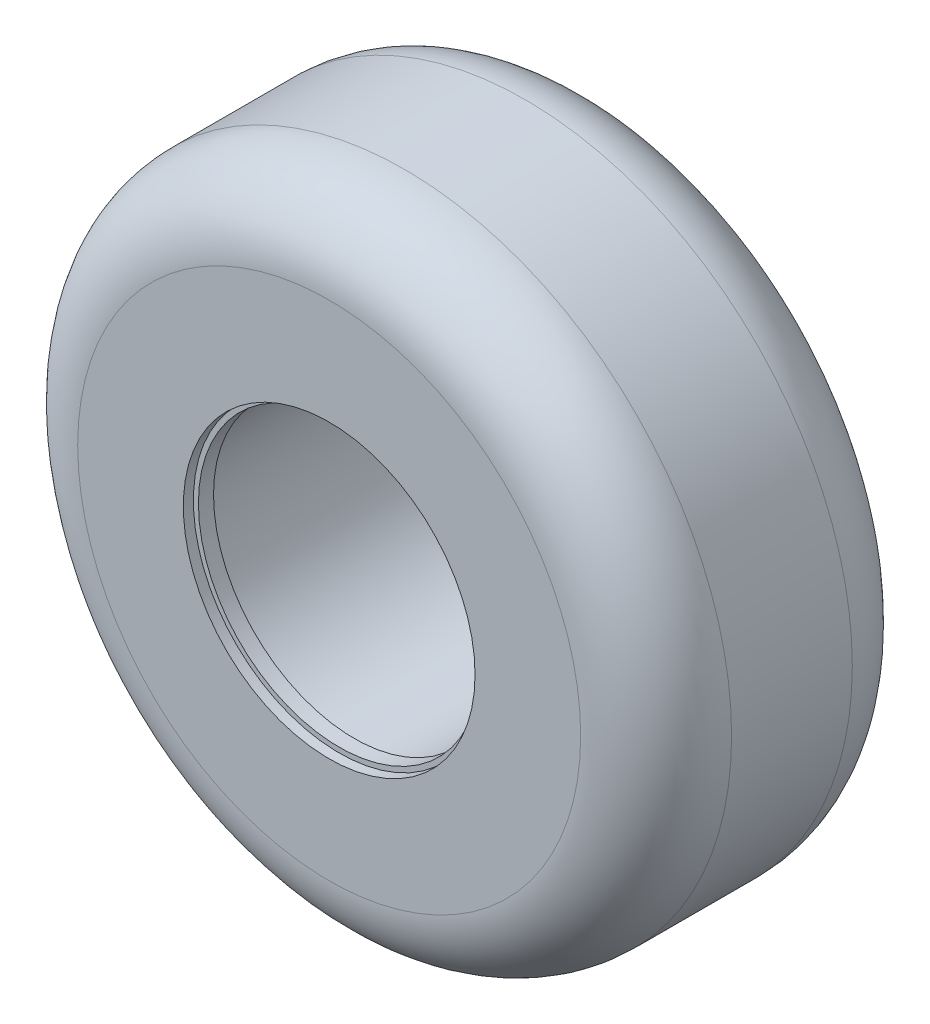
ISO-10303-21;
HEADER;
FILE_DESCRIPTION(('STEP AP214'),'2;1');
FILE_NAME('part.step','',(''),(''),'','','');
FILE_SCHEMA(('AUTOMOTIVE_DESIGN { 1 0 10303 214 1 1 1 1 }'));
ENDSEC;
DATA;
#1=APPLICATION_CONTEXT('core data for automotive mechanical design processes');
#2=APPLICATION_PROTOCOL_DEFINITION('international standard','automotive_design',2000,#1);
#3=PRODUCT_CONTEXT('',#1,'mechanical');
#4=PRODUCT('Part','Part','',(#3));
#5=PRODUCT_RELATED_PRODUCT_CATEGORY('part','',(#4));
#6=PRODUCT_DEFINITION_FORMATION('','',#4);
#7=PRODUCT_DEFINITION_CONTEXT('part definition',#1,'design');
#8=PRODUCT_DEFINITION('design','',#6,#7);
#9=PRODUCT_DEFINITION_SHAPE('','',#8);
#10=(LENGTH_UNIT() NAMED_UNIT(*) SI_UNIT(.MILLI.,.METRE.));
#11=(NAMED_UNIT(*) PLANE_ANGLE_UNIT() SI_UNIT($,.RADIAN.));
#12=(NAMED_UNIT(*) SI_UNIT($,.STERADIAN.) SOLID_ANGLE_UNIT());
#13=UNCERTAINTY_MEASURE_WITH_UNIT(LENGTH_MEASURE(1.E-05),#10,'distance_accuracy_value','');
#14=(GEOMETRIC_REPRESENTATION_CONTEXT(3) GLOBAL_UNCERTAINTY_ASSIGNED_CONTEXT((#13)) GLOBAL_UNIT_ASSIGNED_CONTEXT((#10,
#11,#12)) REPRESENTATION_CONTEXT('',''));
#15=CARTESIAN_POINT('',(0.,0.,0.));
#16=DIRECTION('',(0.,0.,1.));
#17=DIRECTION('',(1.,0.,0.));
#18=AXIS2_PLACEMENT_3D('',#15,#16,#17);
#19=CARTESIAN_POINT('',(0.,0.,54.));
#20=DIRECTION('',(0.,0.,-1.));
#21=DIRECTION('',(-1.,0.,0.));
#22=AXIS2_PLACEMENT_3D('',#19,#20,#21);
#23=CYLINDRICAL_SURFACE('',#22,28.);
#24=CARTESIAN_POINT('',(0.,0.,2.));
#25=DIRECTION('',(0.,0.,-1.));
#26=DIRECTION('',(-1.,0.,0.));
#27=AXIS2_PLACEMENT_3D('',#24,#25,#26);
#28=CIRCLE('',#27,28.);
#29=CARTESIAN_POINT('',(-28.,0.,2.));
#30=VERTEX_POINT('',#29);
#31=EDGE_CURVE('E52',#30,#30,#28,.T.);
#32=ORIENTED_EDGE('',*,*,#31,.T.);
#33=EDGE_LOOP('',(#32));
#34=FACE_BOUND('',#33,.T.);
#35=CARTESIAN_POINT('',(0.,0.,5.));
#36=DIRECTION('',(0.,0.,1.));
#37=DIRECTION('',(1.,0.,0.));
#38=AXIS2_PLACEMENT_3D('',#35,#36,#37);
#39=CIRCLE('',#38,28.);
#40=CARTESIAN_POINT('',(28.,0.,5.));
#41=VERTEX_POINT('',#40);
#42=EDGE_CURVE('E53',#41,#41,#39,.T.);
#43=ORIENTED_EDGE('',*,*,#42,.T.);
#44=EDGE_LOOP('',(#43));
#45=FACE_BOUND('',#44,.T.);
#46=ADVANCED_FACE('F32',(#34,#45),#23,.F.);
#47=CARTESIAN_POINT('',(0.,0.,49.));
#48=DIRECTION('',(0.,0.,1.));
#49=DIRECTION('',(1.,0.,0.));
#50=AXIS2_PLACEMENT_3D('',#47,#48,#49);
#51=CIRCLE('',#50,28.);
#52=CARTESIAN_POINT('',(28.,0.,49.));
#53=VERTEX_POINT('',#52);
#54=EDGE_CURVE('E57',#53,#53,#51,.T.);
#55=ORIENTED_EDGE('',*,*,#54,.F.);
#56=EDGE_LOOP('',(#55));
#57=FACE_BOUND('',#56,.T.);
#58=CARTESIAN_POINT('',(0.,0.,52.));
#59=DIRECTION('',(0.,0.,1.));
#60=DIRECTION('',(1.,0.,0.));
#61=AXIS2_PLACEMENT_3D('',#58,#59,#60);
#62=CIRCLE('',#61,28.);
#63=CARTESIAN_POINT('',(28.,0.,52.));
#64=VERTEX_POINT('',#63);
#65=EDGE_CURVE('E61',#64,#64,#62,.T.);
#66=ORIENTED_EDGE('',*,*,#65,.T.);
#67=EDGE_LOOP('',(#66));
#68=FACE_BOUND('',#67,.T.);
#69=ADVANCED_FACE('F104',(#57,#68),#23,.F.);
#70=CARTESIAN_POINT('',(0.,0.,54.));
#71=DIRECTION('',(0.,0.,1.));
#72=DIRECTION('',(1.,0.,0.));
#73=AXIS2_PLACEMENT_3D('',#70,#71,#72);
#74=PLANE('',#73);
#75=CARTESIAN_POINT('',(0.,0.,54.));
#76=DIRECTION('',(0.,0.,1.));
#77=DIRECTION('',(1.,0.,0.));
#78=AXIS2_PLACEMENT_3D('',#75,#76,#77);
#79=CIRCLE('',#78,50.);
#80=CARTESIAN_POINT('',(50.,0.,54.));
#81=VERTEX_POINT('',#80);
#82=EDGE_CURVE('E10',#81,#81,#79,.T.);
#83=ORIENTED_EDGE('',*,*,#82,.T.);
#84=EDGE_LOOP('',(#83));
#85=FACE_BOUND('',#84,.T.);
#86=CARTESIAN_POINT('',(0.,0.,54.));
#87=DIRECTION('',(0.,0.,1.));
#88=DIRECTION('',(1.,0.,0.));
#89=AXIS2_PLACEMENT_3D('',#86,#87,#88);
#90=CIRCLE('',#89,29.);
#91=CARTESIAN_POINT('',(29.,0.,54.));
#92=VERTEX_POINT('',#91);
#93=EDGE_CURVE('E56',#92,#92,#90,.T.);
#94=ORIENTED_EDGE('',*,*,#93,.F.);
#95=EDGE_LOOP('',(#94));
#96=FACE_BOUND('',#95,.T.);
#97=ADVANCED_FACE('F110',(#85,#96),#74,.T.);
#98=CARTESIAN_POINT('',(0.,0.,0.));
#99=DIRECTION('',(0.,0.,1.));
#100=DIRECTION('',(1.,0.,0.));
#101=AXIS2_PLACEMENT_3D('',#98,#99,#100);
#102=PLANE('',#101);
#103=CARTESIAN_POINT('',(0.,0.,0.));
#104=DIRECTION('',(0.,0.,1.));
#105=DIRECTION('',(1.,0.,0.));
#106=AXIS2_PLACEMENT_3D('',#103,#104,#105);
#107=CIRCLE('',#106,50.);
#108=CARTESIAN_POINT('',(50.,0.,0.));
#109=VERTEX_POINT('',#108);
#110=EDGE_CURVE('E39',#109,#109,#107,.F.);
#111=ORIENTED_EDGE('',*,*,#110,.T.);
#112=EDGE_LOOP('',(#111));
#113=FACE_BOUND('',#112,.T.);
#114=CARTESIAN_POINT('',(0.,0.,0.));
#115=DIRECTION('',(0.,0.,-1.));
#116=DIRECTION('',(-1.,0.,0.));
#117=AXIS2_PLACEMENT_3D('',#114,#115,#116);
#118=CIRCLE('',#117,29.);
#119=CARTESIAN_POINT('',(-29.,0.,0.));
#120=VERTEX_POINT('',#119);
#121=EDGE_CURVE('E64',#120,#120,#118,.T.);
#122=ORIENTED_EDGE('',*,*,#121,.F.);
#123=EDGE_LOOP('',(#122));
#124=FACE_BOUND('',#123,.T.);
#125=ADVANCED_FACE('F119',(#113,#124),#102,.F.);
#126=CARTESIAN_POINT('',(0.,0.,54.));
#127=DIRECTION('',(0.,0.,-1.));
#128=DIRECTION('',(-1.,0.,0.));
#129=AXIS2_PLACEMENT_3D('',#126,#127,#128);
#130=CYLINDRICAL_SURFACE('',#129,65.);
#131=CARTESIAN_POINT('',(0.,0.,15.));
#132=DIRECTION('',(0.,0.,1.));
#133=DIRECTION('',(1.,0.,0.));
#134=AXIS2_PLACEMENT_3D('',#131,#132,#133);
#135=CIRCLE('',#134,65.);
#136=CARTESIAN_POINT('',(65.,0.,15.));
#137=VERTEX_POINT('',#136);
#138=EDGE_CURVE('E43',#137,#137,#135,.T.);
#139=ORIENTED_EDGE('',*,*,#138,.T.);
#140=EDGE_LOOP('',(#139));
#141=FACE_BOUND('',#140,.T.);
#142=CARTESIAN_POINT('',(0.,0.,39.));
#143=DIRECTION('',(0.,0.,1.));
#144=DIRECTION('',(1.,0.,0.));
#145=AXIS2_PLACEMENT_3D('',#142,#143,#144);
#146=CIRCLE('',#145,65.);
#147=CARTESIAN_POINT('',(65.,0.,39.));
#148=VERTEX_POINT('',#147);
#149=EDGE_CURVE('E47',#148,#148,#146,.F.);
#150=ORIENTED_EDGE('',*,*,#149,.T.);
#151=EDGE_LOOP('',(#150));
#152=FACE_BOUND('',#151,.T.);
#153=ADVANCED_FACE('F122',(#141,#152),#130,.T.);
#154=CARTESIAN_POINT('',(0.,0.,2.));
#155=DIRECTION('',(0.,0.,-1.));
#156=DIRECTION('',(-1.,0.,0.));
#157=AXIS2_PLACEMENT_3D('',#154,#155,#156);
#158=CYLINDRICAL_SURFACE('',#157,29.);
#159=CARTESIAN_POINT('',(0.,0.,2.));
#160=DIRECTION('',(0.,0.,-1.));
#161=DIRECTION('',(-1.,0.,0.));
#162=AXIS2_PLACEMENT_3D('',#159,#160,#161);
#163=CIRCLE('',#162,29.);
#164=CARTESIAN_POINT('',(-29.,0.,2.));
#165=VERTEX_POINT('',#164);
#166=EDGE_CURVE('E68',#165,#165,#163,.T.);
#167=ORIENTED_EDGE('',*,*,#166,.F.);
#168=EDGE_LOOP('',(#167));
#169=FACE_BOUND('',#168,.T.);
#170=ORIENTED_EDGE('',*,*,#121,.T.);
#171=EDGE_LOOP('',(#170));
#172=FACE_BOUND('',#171,.T.);
#173=ADVANCED_FACE('F115',(#169,#172),#158,.F.);
#174=CARTESIAN_POINT('',(0.,0.,2.));
#175=DIRECTION('',(0.,0.,-1.));
#176=DIRECTION('',(-1.,0.,0.));
#177=AXIS2_PLACEMENT_3D('',#174,#175,#176);
#178=PLANE('',#177);
#179=ORIENTED_EDGE('',*,*,#31,.F.);
#180=EDGE_LOOP('',(#179));
#181=FACE_BOUND('',#180,.T.);
#182=ORIENTED_EDGE('',*,*,#166,.T.);
#183=EDGE_LOOP('',(#182));
#184=FACE_BOUND('',#183,.T.);
#185=ADVANCED_FACE('F150',(#181,#184),#178,.T.);
#186=CARTESIAN_POINT('',(0.,0.,52.));
#187=DIRECTION('',(0.,0.,1.));
#188=DIRECTION('',(1.,0.,0.));
#189=AXIS2_PLACEMENT_3D('',#186,#187,#188);
#190=CYLINDRICAL_SURFACE('',#189,29.);
#191=CARTESIAN_POINT('',(0.,0.,52.));
#192=DIRECTION('',(0.,0.,1.));
#193=DIRECTION('',(1.,0.,0.));
#194=AXIS2_PLACEMENT_3D('',#191,#192,#193);
#195=CIRCLE('',#194,29.);
#196=CARTESIAN_POINT('',(29.,0.,52.));
#197=VERTEX_POINT('',#196);
#198=EDGE_CURVE('E65',#197,#197,#195,.T.);
#199=ORIENTED_EDGE('',*,*,#198,.F.);
#200=EDGE_LOOP('',(#199));
#201=FACE_BOUND('',#200,.T.);
#202=ORIENTED_EDGE('',*,*,#93,.T.);
#203=EDGE_LOOP('',(#202));
#204=FACE_BOUND('',#203,.T.);
#205=ADVANCED_FACE('F99',(#201,#204),#190,.F.);
#206=CARTESIAN_POINT('',(0.,0.,52.));
#207=DIRECTION('',(0.,0.,1.));
#208=DIRECTION('',(1.,0.,0.));
#209=AXIS2_PLACEMENT_3D('',#206,#207,#208);
#210=PLANE('',#209);
#211=ORIENTED_EDGE('',*,*,#65,.F.);
#212=EDGE_LOOP('',(#211));
#213=FACE_BOUND('',#212,.T.);
#214=ORIENTED_EDGE('',*,*,#198,.T.);
#215=EDGE_LOOP('',(#214));
#216=FACE_BOUND('',#215,.T.);
#217=ADVANCED_FACE('F93',(#213,#216),#210,.T.);
#218=CARTESIAN_POINT('',(0.,0.,5.));
#219=DIRECTION('',(0.,0.,1.));
#220=DIRECTION('',(1.,0.,0.));
#221=AXIS2_PLACEMENT_3D('',#218,#219,#220);
#222=PLANE('',#221);
#223=ORIENTED_EDGE('',*,*,#42,.F.);
#224=EDGE_LOOP('',(#223));
#225=FACE_BOUND('',#224,.T.);
#226=CARTESIAN_POINT('',(0.,0.,5.));
#227=DIRECTION('',(0.,0.,-1.));
#228=DIRECTION('',(-1.,0.,0.));
#229=AXIS2_PLACEMENT_3D('',#226,#227,#228);
#230=CIRCLE('',#229,28.5173811046123);
#231=CARTESIAN_POINT('',(-28.5173811046123,0.,5.));
#232=VERTEX_POINT('',#231);
#233=EDGE_CURVE('E60',#232,#232,#230,.T.);
#234=ORIENTED_EDGE('',*,*,#233,.F.);
#235=EDGE_LOOP('',(#234));
#236=FACE_BOUND('',#235,.T.);
#237=ADVANCED_FACE('F88',(#225,#236),#222,.T.);
#238=CARTESIAN_POINT('',(0.,0.,0.));
#239=DIRECTION('',(0.,0.,-1.));
#240=DIRECTION('',(-1.,0.,0.));
#241=AXIS2_PLACEMENT_3D('',#238,#239,#240);
#242=CYLINDRICAL_SURFACE('',#241,28.5173811046123);
#243=CARTESIAN_POINT('',(0.,0.,49.));
#244=DIRECTION('',(0.,0.,-1.));
#245=DIRECTION('',(-1.,0.,0.));
#246=AXIS2_PLACEMENT_3D('',#243,#244,#245);
#247=CIRCLE('',#246,28.5173811046123);
#248=CARTESIAN_POINT('',(-28.5173811046123,0.,49.));
#249=VERTEX_POINT('',#248);
#250=EDGE_CURVE('E79',#249,#249,#247,.T.);
#251=ORIENTED_EDGE('',*,*,#250,.F.);
#252=EDGE_LOOP('',(#251));
#253=FACE_BOUND('',#252,.T.);
#254=ORIENTED_EDGE('',*,*,#233,.T.);
#255=EDGE_LOOP('',(#254));
#256=FACE_BOUND('',#255,.T.);
#257=ADVANCED_FACE('F85',(#253,#256),#242,.F.);
#258=CARTESIAN_POINT('',(0.,0.,49.));
#259=DIRECTION('',(0.,0.,1.));
#260=DIRECTION('',(1.,0.,0.));
#261=AXIS2_PLACEMENT_3D('',#258,#259,#260);
#262=PLANE('',#261);
#263=ORIENTED_EDGE('',*,*,#54,.T.);
#264=EDGE_LOOP('',(#263));
#265=FACE_BOUND('',#264,.T.);
#266=ORIENTED_EDGE('',*,*,#250,.T.);
#267=EDGE_LOOP('',(#266));
#268=FACE_BOUND('',#267,.T.);
#269=ADVANCED_FACE('F83',(#265,#268),#262,.F.);
#270=CARTESIAN_POINT('',(0.,0.,15.));
#271=DIRECTION('',(0.,0.,1.));
#272=DIRECTION('',(1.,0.,0.));
#273=AXIS2_PLACEMENT_3D('',#270,#271,#272);
#274=TOROIDAL_SURFACE('',#273,50.,15.);
#275=ORIENTED_EDGE('',*,*,#110,.F.);
#276=EDGE_LOOP('',(#275));
#277=FACE_BOUND('',#276,.T.);
#278=ORIENTED_EDGE('',*,*,#138,.F.);
#279=EDGE_LOOP('',(#278));
#280=FACE_BOUND('',#279,.T.);
#281=ADVANCED_FACE('F125',(#277,#280),#274,.T.);
#282=CARTESIAN_POINT('',(0.,0.,39.));
#283=DIRECTION('',(0.,0.,1.));
#284=DIRECTION('',(1.,0.,0.));
#285=AXIS2_PLACEMENT_3D('',#282,#283,#284);
#286=TOROIDAL_SURFACE('',#285,50.,15.);
#287=ORIENTED_EDGE('',*,*,#149,.F.);
#288=EDGE_LOOP('',(#287));
#289=FACE_BOUND('',#288,.T.);
#290=ORIENTED_EDGE('',*,*,#82,.F.);
#291=EDGE_LOOP('',(#290));
#292=FACE_BOUND('',#291,.T.);
#293=ADVANCED_FACE('F34',(#289,#292),#286,.T.);
#294=CLOSED_SHELL('',(#46,#69,#97,#125,#153,#173,#185,#205,#217,#237,#257,#269,#281,#293));
#295=MANIFOLD_SOLID_BREP('B2',#294);
#296=ADVANCED_BREP_SHAPE_REPRESENTATION('',(#18,#295),#14);
#297=SHAPE_DEFINITION_REPRESENTATION(#9,#296);
ENDSEC;
END-ISO-10303-21;
